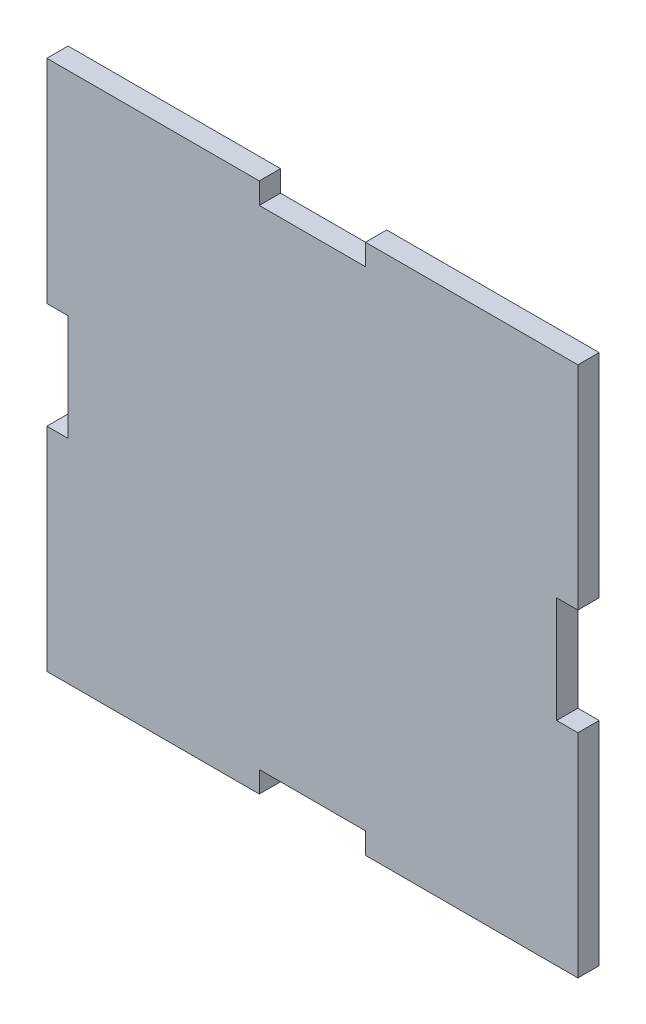
ISO-10303-21;
HEADER;
FILE_DESCRIPTION(('STEP AP214'),'2;1');
FILE_NAME('part.step','',(''),(''),'','','');
FILE_SCHEMA(('AUTOMOTIVE_DESIGN { 1 0 10303 214 1 1 1 1 }'));
ENDSEC;
DATA;
#1=APPLICATION_CONTEXT('core data for automotive mechanical design processes');
#2=APPLICATION_PROTOCOL_DEFINITION('international standard','automotive_design',2000,#1);
#3=PRODUCT_CONTEXT('',#1,'mechanical');
#4=PRODUCT('Part','Part','',(#3));
#5=PRODUCT_RELATED_PRODUCT_CATEGORY('part','',(#4));
#6=PRODUCT_DEFINITION_FORMATION('','',#4);
#7=PRODUCT_DEFINITION_CONTEXT('part definition',#1,'design');
#8=PRODUCT_DEFINITION('design','',#6,#7);
#9=PRODUCT_DEFINITION_SHAPE('','',#8);
#10=(LENGTH_UNIT() NAMED_UNIT(*) SI_UNIT(.MILLI.,.METRE.));
#11=(NAMED_UNIT(*) PLANE_ANGLE_UNIT() SI_UNIT($,.RADIAN.));
#12=(NAMED_UNIT(*) SI_UNIT($,.STERADIAN.) SOLID_ANGLE_UNIT());
#13=UNCERTAINTY_MEASURE_WITH_UNIT(LENGTH_MEASURE(1.E-05),#10,'distance_accuracy_value','');
#14=(GEOMETRIC_REPRESENTATION_CONTEXT(3) GLOBAL_UNCERTAINTY_ASSIGNED_CONTEXT((#13)) GLOBAL_UNIT_ASSIGNED_CONTEXT((#10,
#11,#12)) REPRESENTATION_CONTEXT('',''));
#15=CARTESIAN_POINT('',(0.,0.,0.));
#16=DIRECTION('',(0.,0.,1.));
#17=DIRECTION('',(1.,0.,0.));
#18=AXIS2_PLACEMENT_3D('',#15,#16,#17);
#19=CARTESIAN_POINT('',(96.,0.,4.));
#20=DIRECTION('',(1.,0.,0.));
#21=DIRECTION('',(0.,1.,0.));
#22=AXIS2_PLACEMENT_3D('',#19,#20,#21);
#23=PLANE('',#22);
#24=DIRECTION('',(0.,-1.,0.));
#25=VECTOR('',#24,1.);
#26=CARTESIAN_POINT('',(96.,0.,0.));
#27=LINE('',#26,#25);
#28=CARTESIAN_POINT('',(96.,60.,0.));
#29=VERTEX_POINT('',#28);
#30=CARTESIAN_POINT('',(96.,40.,0.));
#31=VERTEX_POINT('',#30);
#32=EDGE_CURVE('E308',#29,#31,#27,.T.);
#33=ORIENTED_EDGE('',*,*,#32,.F.);
#34=DIRECTION('',(0.,0.,-1.));
#35=VECTOR('',#34,1.);
#36=CARTESIAN_POINT('',(96.,60.,4.));
#37=LINE('',#36,#35);
#38=CARTESIAN_POINT('',(96.,60.,4.));
#39=VERTEX_POINT('',#38);
#40=EDGE_CURVE('E11',#39,#29,#37,.T.);
#41=ORIENTED_EDGE('',*,*,#40,.F.);
#42=DIRECTION('',(0.,-1.,0.));
#43=VECTOR('',#42,1.);
#44=CARTESIAN_POINT('',(96.,0.,4.));
#45=LINE('',#44,#43);
#46=CARTESIAN_POINT('',(96.,40.,4.));
#47=VERTEX_POINT('',#46);
#48=EDGE_CURVE('E224',#39,#47,#45,.T.);
#49=ORIENTED_EDGE('',*,*,#48,.T.);
#50=DIRECTION('',(0.,0.,-1.));
#51=VECTOR('',#50,1.);
#52=CARTESIAN_POINT('',(96.,40.,4.));
#53=LINE('',#52,#51);
#54=EDGE_CURVE('E129',#47,#31,#53,.T.);
#55=ORIENTED_EDGE('',*,*,#54,.T.);
#56=EDGE_LOOP('',(#33,#41,#49,#55));
#57=FACE_BOUND('',#56,.T.);
#58=ADVANCED_FACE('F41',(#57),#23,.T.);
#59=CARTESIAN_POINT('',(0.,60.,4.));
#60=DIRECTION('',(0.,-1.,0.));
#61=DIRECTION('',(0.,0.,-1.));
#62=AXIS2_PLACEMENT_3D('',#59,#60,#61);
#63=PLANE('',#62);
#64=DIRECTION('',(-1.,0.,0.));
#65=VECTOR('',#64,1.);
#66=CARTESIAN_POINT('',(0.,60.,0.));
#67=LINE('',#66,#65);
#68=CARTESIAN_POINT('',(100.,60.,0.));
#69=VERTEX_POINT('',#68);
#70=EDGE_CURVE('E301',#69,#29,#67,.T.);
#71=ORIENTED_EDGE('',*,*,#70,.F.);
#72=DIRECTION('',(0.,0.,-1.));
#73=VECTOR('',#72,1.);
#74=CARTESIAN_POINT('',(100.,60.,4.));
#75=LINE('',#74,#73);
#76=CARTESIAN_POINT('',(100.,60.,4.));
#77=VERTEX_POINT('',#76);
#78=EDGE_CURVE('E50',#77,#69,#75,.T.);
#79=ORIENTED_EDGE('',*,*,#78,.F.);
#80=DIRECTION('',(-1.,0.,0.));
#81=VECTOR('',#80,1.);
#82=CARTESIAN_POINT('',(0.,60.,4.));
#83=LINE('',#82,#81);
#84=EDGE_CURVE('E213',#77,#39,#83,.T.);
#85=ORIENTED_EDGE('',*,*,#84,.T.);
#86=ORIENTED_EDGE('',*,*,#40,.T.);
#87=EDGE_LOOP('',(#71,#79,#85,#86));
#88=FACE_BOUND('',#87,.T.);
#89=ADVANCED_FACE('F306',(#88),#63,.T.);
#90=CARTESIAN_POINT('',(100.,0.,4.));
#91=DIRECTION('',(-1.,0.,0.));
#92=DIRECTION('',(0.,0.,1.));
#93=AXIS2_PLACEMENT_3D('',#90,#91,#92);
#94=PLANE('',#93);
#95=DIRECTION('',(0.,1.,0.));
#96=VECTOR('',#95,1.);
#97=CARTESIAN_POINT('',(100.,0.,0.));
#98=LINE('',#97,#96);
#99=CARTESIAN_POINT('',(100.,100.,0.));
#100=VERTEX_POINT('',#99);
#101=EDGE_CURVE('E236',#69,#100,#98,.T.);
#102=ORIENTED_EDGE('',*,*,#101,.T.);
#103=DIRECTION('',(0.,0.,-1.));
#104=VECTOR('',#103,1.);
#105=CARTESIAN_POINT('',(100.,100.,4.));
#106=LINE('',#105,#104);
#107=CARTESIAN_POINT('',(100.,100.,4.));
#108=VERTEX_POINT('',#107);
#109=EDGE_CURVE('E289',#108,#100,#106,.T.);
#110=ORIENTED_EDGE('',*,*,#109,.F.);
#111=DIRECTION('',(0.,1.,0.));
#112=VECTOR('',#111,1.);
#113=CARTESIAN_POINT('',(100.,0.,4.));
#114=LINE('',#113,#112);
#115=EDGE_CURVE('E206',#77,#108,#114,.T.);
#116=ORIENTED_EDGE('',*,*,#115,.F.);
#117=ORIENTED_EDGE('',*,*,#78,.T.);
#118=EDGE_LOOP('',(#102,#110,#116,#117));
#119=FACE_BOUND('',#118,.T.);
#120=ADVANCED_FACE('F295',(#119),#94,.F.);
#121=CARTESIAN_POINT('',(0.,100.,4.));
#122=DIRECTION('',(0.,1.,0.));
#123=DIRECTION('',(0.,0.,1.));
#124=AXIS2_PLACEMENT_3D('',#121,#122,#123);
#125=PLANE('',#124);
#126=DIRECTION('',(1.,0.,0.));
#127=VECTOR('',#126,1.);
#128=CARTESIAN_POINT('',(0.,100.,0.));
#129=LINE('',#128,#127);
#130=CARTESIAN_POINT('',(60.,100.,0.));
#131=VERTEX_POINT('',#130);
#132=EDGE_CURVE('E304',#131,#100,#129,.T.);
#133=ORIENTED_EDGE('',*,*,#132,.F.);
#134=DIRECTION('',(0.,0.,-1.));
#135=VECTOR('',#134,1.);
#136=CARTESIAN_POINT('',(60.,100.,4.));
#137=LINE('',#136,#135);
#138=CARTESIAN_POINT('',(60.,100.,4.));
#139=VERTEX_POINT('',#138);
#140=EDGE_CURVE('E286',#139,#131,#137,.T.);
#141=ORIENTED_EDGE('',*,*,#140,.F.);
#142=DIRECTION('',(1.,0.,0.));
#143=VECTOR('',#142,1.);
#144=CARTESIAN_POINT('',(0.,100.,4.));
#145=LINE('',#144,#143);
#146=EDGE_CURVE('E212',#139,#108,#145,.T.);
#147=ORIENTED_EDGE('',*,*,#146,.T.);
#148=ORIENTED_EDGE('',*,*,#109,.T.);
#149=EDGE_LOOP('',(#133,#141,#147,#148));
#150=FACE_BOUND('',#149,.T.);
#151=ADVANCED_FACE('F463',(#150),#125,.T.);
#152=CARTESIAN_POINT('',(60.,0.,4.));
#153=DIRECTION('',(1.,0.,0.));
#154=DIRECTION('',(0.,0.,-1.));
#155=AXIS2_PLACEMENT_3D('',#152,#153,#154);
#156=PLANE('',#155);
#157=DIRECTION('',(0.,-1.,0.));
#158=VECTOR('',#157,1.);
#159=CARTESIAN_POINT('',(60.,0.,0.));
#160=LINE('',#159,#158);
#161=CARTESIAN_POINT('',(60.,96.,0.));
#162=VERTEX_POINT('',#161);
#163=EDGE_CURVE('E315',#131,#162,#160,.T.);
#164=ORIENTED_EDGE('',*,*,#163,.T.);
#165=DIRECTION('',(0.,0.,-1.));
#166=VECTOR('',#165,1.);
#167=CARTESIAN_POINT('',(60.,96.,4.));
#168=LINE('',#167,#166);
#169=CARTESIAN_POINT('',(60.,96.,4.));
#170=VERTEX_POINT('',#169);
#171=EDGE_CURVE('E283',#170,#162,#168,.T.);
#172=ORIENTED_EDGE('',*,*,#171,.F.);
#173=DIRECTION('',(0.,-1.,0.));
#174=VECTOR('',#173,1.);
#175=CARTESIAN_POINT('',(60.,0.,4.));
#176=LINE('',#175,#174);
#177=EDGE_CURVE('E221',#139,#170,#176,.T.);
#178=ORIENTED_EDGE('',*,*,#177,.F.);
#179=ORIENTED_EDGE('',*,*,#140,.T.);
#180=EDGE_LOOP('',(#164,#172,#178,#179));
#181=FACE_BOUND('',#180,.T.);
#182=ADVANCED_FACE('F404',(#181),#156,.F.);
#183=CARTESIAN_POINT('',(0.,96.,4.));
#184=DIRECTION('',(0.,1.,0.));
#185=DIRECTION('',(0.,0.,1.));
#186=AXIS2_PLACEMENT_3D('',#183,#184,#185);
#187=PLANE('',#186);
#188=DIRECTION('',(1.,0.,0.));
#189=VECTOR('',#188,1.);
#190=CARTESIAN_POINT('',(0.,96.,0.));
#191=LINE('',#190,#189);
#192=CARTESIAN_POINT('',(40.,96.,0.));
#193=VERTEX_POINT('',#192);
#194=EDGE_CURVE('E320',#193,#162,#191,.T.);
#195=ORIENTED_EDGE('',*,*,#194,.F.);
#196=DIRECTION('',(0.,0.,-1.));
#197=VECTOR('',#196,1.);
#198=CARTESIAN_POINT('',(40.,96.,4.));
#199=LINE('',#198,#197);
#200=CARTESIAN_POINT('',(40.,96.,4.));
#201=VERTEX_POINT('',#200);
#202=EDGE_CURVE('E280',#201,#193,#199,.T.);
#203=ORIENTED_EDGE('',*,*,#202,.F.);
#204=DIRECTION('',(1.,0.,0.));
#205=VECTOR('',#204,1.);
#206=CARTESIAN_POINT('',(0.,96.,4.));
#207=LINE('',#206,#205);
#208=EDGE_CURVE('E394',#201,#170,#207,.T.);
#209=ORIENTED_EDGE('',*,*,#208,.T.);
#210=ORIENTED_EDGE('',*,*,#171,.T.);
#211=EDGE_LOOP('',(#195,#203,#209,#210));
#212=FACE_BOUND('',#211,.T.);
#213=ADVANCED_FACE('F407',(#212),#187,.T.);
#214=CARTESIAN_POINT('',(40.,0.,4.));
#215=DIRECTION('',(1.,0.,0.));
#216=DIRECTION('',(0.,0.,-1.));
#217=AXIS2_PLACEMENT_3D('',#214,#215,#216);
#218=PLANE('',#217);
#219=DIRECTION('',(0.,-1.,0.));
#220=VECTOR('',#219,1.);
#221=CARTESIAN_POINT('',(40.,0.,0.));
#222=LINE('',#221,#220);
#223=CARTESIAN_POINT('',(40.,100.,0.));
#224=VERTEX_POINT('',#223);
#225=EDGE_CURVE('E324',#224,#193,#222,.T.);
#226=ORIENTED_EDGE('',*,*,#225,.F.);
#227=DIRECTION('',(0.,0.,-1.));
#228=VECTOR('',#227,1.);
#229=CARTESIAN_POINT('',(40.,100.,4.));
#230=LINE('',#229,#228);
#231=CARTESIAN_POINT('',(40.,100.,4.));
#232=VERTEX_POINT('',#231);
#233=EDGE_CURVE('E277',#232,#224,#230,.T.);
#234=ORIENTED_EDGE('',*,*,#233,.F.);
#235=DIRECTION('',(0.,-1.,0.));
#236=VECTOR('',#235,1.);
#237=CARTESIAN_POINT('',(40.,0.,4.));
#238=LINE('',#237,#236);
#239=EDGE_CURVE('E390',#232,#201,#238,.T.);
#240=ORIENTED_EDGE('',*,*,#239,.T.);
#241=ORIENTED_EDGE('',*,*,#202,.T.);
#242=EDGE_LOOP('',(#226,#234,#240,#241));
#243=FACE_BOUND('',#242,.T.);
#244=ADVANCED_FACE('F410',(#243),#218,.T.);
#245=CARTESIAN_POINT('',(0.,100.,0.));
#246=VERTEX_POINT('',#245);
#247=EDGE_CURVE('E316',#246,#224,#129,.T.);
#248=ORIENTED_EDGE('',*,*,#247,.F.);
#249=DIRECTION('',(0.,0.,-1.));
#250=VECTOR('',#249,1.);
#251=CARTESIAN_POINT('',(0.,100.,4.));
#252=LINE('',#251,#250);
#253=CARTESIAN_POINT('',(0.,100.,4.));
#254=VERTEX_POINT('',#253);
#255=EDGE_CURVE('E274',#254,#246,#252,.T.);
#256=ORIENTED_EDGE('',*,*,#255,.F.);
#257=EDGE_CURVE('E222',#254,#232,#145,.T.);
#258=ORIENTED_EDGE('',*,*,#257,.T.);
#259=ORIENTED_EDGE('',*,*,#233,.T.);
#260=EDGE_LOOP('',(#248,#256,#258,#259));
#261=FACE_BOUND('',#260,.T.);
#262=ADVANCED_FACE('F417',(#261),#125,.T.);
#263=CARTESIAN_POINT('',(0.,0.,4.));
#264=DIRECTION('',(-1.,0.,0.));
#265=DIRECTION('',(0.,0.,1.));
#266=AXIS2_PLACEMENT_3D('',#263,#264,#265);
#267=PLANE('',#266);
#268=DIRECTION('',(0.,1.,0.));
#269=VECTOR('',#268,1.);
#270=CARTESIAN_POINT('',(0.,0.,0.));
#271=LINE('',#270,#269);
#272=CARTESIAN_POINT('',(0.,60.,0.));
#273=VERTEX_POINT('',#272);
#274=EDGE_CURVE('E328',#273,#246,#271,.T.);
#275=ORIENTED_EDGE('',*,*,#274,.F.);
#276=DIRECTION('',(0.,0.,-1.));
#277=VECTOR('',#276,1.);
#278=CARTESIAN_POINT('',(0.,60.,4.));
#279=LINE('',#278,#277);
#280=CARTESIAN_POINT('',(0.,60.,4.));
#281=VERTEX_POINT('',#280);
#282=EDGE_CURVE('E271',#281,#273,#279,.T.);
#283=ORIENTED_EDGE('',*,*,#282,.F.);
#284=DIRECTION('',(0.,1.,0.));
#285=VECTOR('',#284,1.);
#286=CARTESIAN_POINT('',(0.,0.,4.));
#287=LINE('',#286,#285);
#288=EDGE_CURVE('E386',#281,#254,#287,.T.);
#289=ORIENTED_EDGE('',*,*,#288,.T.);
#290=ORIENTED_EDGE('',*,*,#255,.T.);
#291=EDGE_LOOP('',(#275,#283,#289,#290));
#292=FACE_BOUND('',#291,.T.);
#293=ADVANCED_FACE('F441',(#292),#267,.T.);
#294=CARTESIAN_POINT('',(0.,60.,4.));
#295=DIRECTION('',(0.,1.,0.));
#296=DIRECTION('',(0.,0.,1.));
#297=AXIS2_PLACEMENT_3D('',#294,#295,#296);
#298=PLANE('',#297);
#299=DIRECTION('',(1.,0.,0.));
#300=VECTOR('',#299,1.);
#301=CARTESIAN_POINT('',(0.,60.,0.));
#302=LINE('',#301,#300);
#303=CARTESIAN_POINT('',(4.,60.,0.));
#304=VERTEX_POINT('',#303);
#305=EDGE_CURVE('E332',#273,#304,#302,.T.);
#306=ORIENTED_EDGE('',*,*,#305,.T.);
#307=DIRECTION('',(0.,0.,-1.));
#308=VECTOR('',#307,1.);
#309=CARTESIAN_POINT('',(4.,60.,4.));
#310=LINE('',#309,#308);
#311=CARTESIAN_POINT('',(4.,60.,4.));
#312=VERTEX_POINT('',#311);
#313=EDGE_CURVE('E267',#312,#304,#310,.T.);
#314=ORIENTED_EDGE('',*,*,#313,.F.);
#315=DIRECTION('',(1.,0.,0.));
#316=VECTOR('',#315,1.);
#317=CARTESIAN_POINT('',(0.,60.,4.));
#318=LINE('',#317,#316);
#319=EDGE_CURVE('E383',#281,#312,#318,.T.);
#320=ORIENTED_EDGE('',*,*,#319,.F.);
#321=ORIENTED_EDGE('',*,*,#282,.T.);
#322=EDGE_LOOP('',(#306,#314,#320,#321));
#323=FACE_BOUND('',#322,.T.);
#324=ADVANCED_FACE('F445',(#323),#298,.F.);
#325=CARTESIAN_POINT('',(4.,0.,4.));
#326=DIRECTION('',(1.,0.,0.));
#327=DIRECTION('',(0.,1.,0.));
#328=AXIS2_PLACEMENT_3D('',#325,#326,#327);
#329=PLANE('',#328);
#330=DIRECTION('',(0.,-1.,0.));
#331=VECTOR('',#330,1.);
#332=CARTESIAN_POINT('',(4.,0.,0.));
#333=LINE('',#332,#331);
#334=CARTESIAN_POINT('',(4.,40.,0.));
#335=VERTEX_POINT('',#334);
#336=EDGE_CURVE('E336',#304,#335,#333,.T.);
#337=ORIENTED_EDGE('',*,*,#336,.T.);
#338=DIRECTION('',(0.,0.,-1.));
#339=VECTOR('',#338,1.);
#340=CARTESIAN_POINT('',(4.,40.,4.));
#341=LINE('',#340,#339);
#342=CARTESIAN_POINT('',(4.,40.,4.));
#343=VERTEX_POINT('',#342);
#344=EDGE_CURVE('E264',#343,#335,#341,.T.);
#345=ORIENTED_EDGE('',*,*,#344,.F.);
#346=DIRECTION('',(0.,-1.,0.));
#347=VECTOR('',#346,1.);
#348=CARTESIAN_POINT('',(4.,0.,4.));
#349=LINE('',#348,#347);
#350=EDGE_CURVE('E380',#312,#343,#349,.T.);
#351=ORIENTED_EDGE('',*,*,#350,.F.);
#352=ORIENTED_EDGE('',*,*,#313,.T.);
#353=EDGE_LOOP('',(#337,#345,#351,#352));
#354=FACE_BOUND('',#353,.T.);
#355=ADVANCED_FACE('F447',(#354),#329,.F.);
#356=CARTESIAN_POINT('',(0.,40.,4.));
#357=DIRECTION('',(0.,1.,0.));
#358=DIRECTION('',(0.,0.,1.));
#359=AXIS2_PLACEMENT_3D('',#356,#357,#358);
#360=PLANE('',#359);
#361=DIRECTION('',(1.,0.,0.));
#362=VECTOR('',#361,1.);
#363=CARTESIAN_POINT('',(0.,40.,0.));
#364=LINE('',#363,#362);
#365=CARTESIAN_POINT('',(0.,40.,0.));
#366=VERTEX_POINT('',#365);
#367=EDGE_CURVE('E340',#366,#335,#364,.T.);
#368=ORIENTED_EDGE('',*,*,#367,.F.);
#369=DIRECTION('',(0.,0.,-1.));
#370=VECTOR('',#369,1.);
#371=CARTESIAN_POINT('',(0.,40.,4.));
#372=LINE('',#371,#370);
#373=CARTESIAN_POINT('',(0.,40.,4.));
#374=VERTEX_POINT('',#373);
#375=EDGE_CURVE('E261',#374,#366,#372,.T.);
#376=ORIENTED_EDGE('',*,*,#375,.F.);
#377=DIRECTION('',(1.,0.,0.));
#378=VECTOR('',#377,1.);
#379=CARTESIAN_POINT('',(0.,40.,4.));
#380=LINE('',#379,#378);
#381=EDGE_CURVE('E376',#374,#343,#380,.T.);
#382=ORIENTED_EDGE('',*,*,#381,.T.);
#383=ORIENTED_EDGE('',*,*,#344,.T.);
#384=EDGE_LOOP('',(#368,#376,#382,#383));
#385=FACE_BOUND('',#384,.T.);
#386=ADVANCED_FACE('F432',(#385),#360,.T.);
#387=CARTESIAN_POINT('',(0.,0.,0.));
#388=VERTEX_POINT('',#387);
#389=EDGE_CURVE('E333',#388,#366,#271,.T.);
#390=ORIENTED_EDGE('',*,*,#389,.F.);
#391=DIRECTION('',(0.,0.,-1.));
#392=VECTOR('',#391,1.);
#393=CARTESIAN_POINT('',(0.,0.,4.));
#394=LINE('',#393,#392);
#395=CARTESIAN_POINT('',(0.,0.,4.));
#396=VERTEX_POINT('',#395);
#397=EDGE_CURVE('E258',#396,#388,#394,.T.);
#398=ORIENTED_EDGE('',*,*,#397,.F.);
#399=EDGE_CURVE('E375',#396,#374,#287,.T.);
#400=ORIENTED_EDGE('',*,*,#399,.T.);
#401=ORIENTED_EDGE('',*,*,#375,.T.);
#402=EDGE_LOOP('',(#390,#398,#400,#401));
#403=FACE_BOUND('',#402,.T.);
#404=ADVANCED_FACE('F424',(#403),#267,.T.);
#405=CARTESIAN_POINT('',(0.,0.,4.));
#406=DIRECTION('',(0.,1.,0.));
#407=DIRECTION('',(0.,0.,1.));
#408=AXIS2_PLACEMENT_3D('',#405,#406,#407);
#409=PLANE('',#408);
#410=DIRECTION('',(1.,0.,0.));
#411=VECTOR('',#410,1.);
#412=CARTESIAN_POINT('',(0.,0.,0.));
#413=LINE('',#412,#411);
#414=CARTESIAN_POINT('',(40.,0.,0.));
#415=VERTEX_POINT('',#414);
#416=EDGE_CURVE('E344',#388,#415,#413,.T.);
#417=ORIENTED_EDGE('',*,*,#416,.T.);
#418=DIRECTION('',(0.,0.,-1.));
#419=VECTOR('',#418,1.);
#420=CARTESIAN_POINT('',(40.,0.,4.));
#421=LINE('',#420,#419);
#422=CARTESIAN_POINT('',(40.,0.,4.));
#423=VERTEX_POINT('',#422);
#424=EDGE_CURVE('E254',#423,#415,#421,.T.);
#425=ORIENTED_EDGE('',*,*,#424,.F.);
#426=DIRECTION('',(1.,0.,0.));
#427=VECTOR('',#426,1.);
#428=CARTESIAN_POINT('',(0.,0.,4.));
#429=LINE('',#428,#427);
#430=EDGE_CURVE('E194',#396,#423,#429,.T.);
#431=ORIENTED_EDGE('',*,*,#430,.F.);
#432=ORIENTED_EDGE('',*,*,#397,.T.);
#433=EDGE_LOOP('',(#417,#425,#431,#432));
#434=FACE_BOUND('',#433,.T.);
#435=ADVANCED_FACE('F530',(#434),#409,.F.);
#436=CARTESIAN_POINT('',(40.,0.,4.));
#437=DIRECTION('',(-1.,0.,0.));
#438=DIRECTION('',(0.,0.,1.));
#439=AXIS2_PLACEMENT_3D('',#436,#437,#438);
#440=PLANE('',#439);
#441=DIRECTION('',(0.,1.,0.));
#442=VECTOR('',#441,1.);
#443=CARTESIAN_POINT('',(40.,0.,0.));
#444=LINE('',#443,#442);
#445=CARTESIAN_POINT('',(40.,4.,0.));
#446=VERTEX_POINT('',#445);
#447=EDGE_CURVE('E347',#415,#446,#444,.T.);
#448=ORIENTED_EDGE('',*,*,#447,.T.);
#449=DIRECTION('',(0.,0.,-1.));
#450=VECTOR('',#449,1.);
#451=CARTESIAN_POINT('',(40.,4.,4.));
#452=LINE('',#451,#450);
#453=CARTESIAN_POINT('',(40.,4.,4.));
#454=VERTEX_POINT('',#453);
#455=EDGE_CURVE('E250',#454,#446,#452,.T.);
#456=ORIENTED_EDGE('',*,*,#455,.F.);
#457=DIRECTION('',(0.,1.,0.));
#458=VECTOR('',#457,1.);
#459=CARTESIAN_POINT('',(40.,0.,4.));
#460=LINE('',#459,#458);
#461=EDGE_CURVE('E367',#423,#454,#460,.T.);
#462=ORIENTED_EDGE('',*,*,#461,.F.);
#463=ORIENTED_EDGE('',*,*,#424,.T.);
#464=EDGE_LOOP('',(#448,#456,#462,#463));
#465=FACE_BOUND('',#464,.T.);
#466=ADVANCED_FACE('F538',(#465),#440,.F.);
#467=CARTESIAN_POINT('',(0.,4.,4.));
#468=DIRECTION('',(0.,1.,0.));
#469=DIRECTION('',(0.,0.,1.));
#470=AXIS2_PLACEMENT_3D('',#467,#468,#469);
#471=PLANE('',#470);
#472=DIRECTION('',(1.,0.,0.));
#473=VECTOR('',#472,1.);
#474=CARTESIAN_POINT('',(0.,4.,0.));
#475=LINE('',#474,#473);
#476=CARTESIAN_POINT('',(60.,4.,0.));
#477=VERTEX_POINT('',#476);
#478=EDGE_CURVE('E349',#446,#477,#475,.T.);
#479=ORIENTED_EDGE('',*,*,#478,.T.);
#480=DIRECTION('',(0.,0.,-1.));
#481=VECTOR('',#480,1.);
#482=CARTESIAN_POINT('',(60.,4.,4.));
#483=LINE('',#482,#481);
#484=CARTESIAN_POINT('',(60.,4.,4.));
#485=VERTEX_POINT('',#484);
#486=EDGE_CURVE('E247',#485,#477,#483,.T.);
#487=ORIENTED_EDGE('',*,*,#486,.F.);
#488=DIRECTION('',(1.,0.,0.));
#489=VECTOR('',#488,1.);
#490=CARTESIAN_POINT('',(0.,4.,4.));
#491=LINE('',#490,#489);
#492=EDGE_CURVE('E364',#454,#485,#491,.T.);
#493=ORIENTED_EDGE('',*,*,#492,.F.);
#494=ORIENTED_EDGE('',*,*,#455,.T.);
#495=EDGE_LOOP('',(#479,#487,#493,#494));
#496=FACE_BOUND('',#495,.T.);
#497=ADVANCED_FACE('F363',(#496),#471,.F.);
#498=CARTESIAN_POINT('',(60.,0.,4.));
#499=DIRECTION('',(-1.,0.,0.));
#500=DIRECTION('',(0.,0.,1.));
#501=AXIS2_PLACEMENT_3D('',#498,#499,#500);
#502=PLANE('',#501);
#503=DIRECTION('',(0.,1.,0.));
#504=VECTOR('',#503,1.);
#505=CARTESIAN_POINT('',(60.,0.,0.));
#506=LINE('',#505,#504);
#507=CARTESIAN_POINT('',(60.,0.,0.));
#508=VERTEX_POINT('',#507);
#509=EDGE_CURVE('E239',#508,#477,#506,.T.);
#510=ORIENTED_EDGE('',*,*,#509,.F.);
#511=DIRECTION('',(0.,0.,-1.));
#512=VECTOR('',#511,1.);
#513=CARTESIAN_POINT('',(60.,0.,4.));
#514=LINE('',#513,#512);
#515=CARTESIAN_POINT('',(60.,0.,4.));
#516=VERTEX_POINT('',#515);
#517=EDGE_CURVE('E200',#516,#508,#514,.T.);
#518=ORIENTED_EDGE('',*,*,#517,.F.);
#519=DIRECTION('',(0.,1.,0.));
#520=VECTOR('',#519,1.);
#521=CARTESIAN_POINT('',(60.,0.,4.));
#522=LINE('',#521,#520);
#523=EDGE_CURVE('E190',#516,#485,#522,.T.);
#524=ORIENTED_EDGE('',*,*,#523,.T.);
#525=ORIENTED_EDGE('',*,*,#486,.T.);
#526=EDGE_LOOP('',(#510,#518,#524,#525));
#527=FACE_BOUND('',#526,.T.);
#528=ADVANCED_FACE('F361',(#527),#502,.T.);
#529=CARTESIAN_POINT('',(100.,0.,0.));
#530=VERTEX_POINT('',#529);
#531=EDGE_CURVE('E198',#508,#530,#413,.T.);
#532=ORIENTED_EDGE('',*,*,#531,.T.);
#533=DIRECTION('',(0.,0.,-1.));
#534=VECTOR('',#533,1.);
#535=CARTESIAN_POINT('',(100.,0.,4.));
#536=LINE('',#535,#534);
#537=CARTESIAN_POINT('',(100.,0.,4.));
#538=VERTEX_POINT('',#537);
#539=EDGE_CURVE('E195',#538,#530,#536,.T.);
#540=ORIENTED_EDGE('',*,*,#539,.F.);
#541=EDGE_CURVE('E184',#516,#538,#429,.T.);
#542=ORIENTED_EDGE('',*,*,#541,.F.);
#543=ORIENTED_EDGE('',*,*,#517,.T.);
#544=EDGE_LOOP('',(#532,#540,#542,#543));
#545=FACE_BOUND('',#544,.T.);
#546=ADVANCED_FACE('F196',(#545),#409,.F.);
#547=CARTESIAN_POINT('',(100.,40.,0.));
#548=VERTEX_POINT('',#547);
#549=EDGE_CURVE('E122',#530,#548,#98,.T.);
#550=ORIENTED_EDGE('',*,*,#549,.T.);
#551=DIRECTION('',(0.,0.,-1.));
#552=VECTOR('',#551,1.);
#553=CARTESIAN_POINT('',(100.,40.,4.));
#554=LINE('',#553,#552);
#555=CARTESIAN_POINT('',(100.,40.,4.));
#556=VERTEX_POINT('',#555);
#557=EDGE_CURVE('E201',#556,#548,#554,.T.);
#558=ORIENTED_EDGE('',*,*,#557,.F.);
#559=EDGE_CURVE('E188',#538,#556,#114,.T.);
#560=ORIENTED_EDGE('',*,*,#559,.F.);
#561=ORIENTED_EDGE('',*,*,#539,.T.);
#562=EDGE_LOOP('',(#550,#558,#560,#561));
#563=FACE_BOUND('',#562,.T.);
#564=ADVANCED_FACE('F203',(#563),#94,.F.);
#565=CARTESIAN_POINT('',(0.,40.,4.));
#566=DIRECTION('',(0.,-1.,0.));
#567=DIRECTION('',(0.,0.,-1.));
#568=AXIS2_PLACEMENT_3D('',#565,#566,#567);
#569=PLANE('',#568);
#570=DIRECTION('',(-1.,0.,0.));
#571=VECTOR('',#570,1.);
#572=CARTESIAN_POINT('',(0.,40.,0.));
#573=LINE('',#572,#571);
#574=EDGE_CURVE('E227',#548,#31,#573,.T.);
#575=ORIENTED_EDGE('',*,*,#574,.T.);
#576=ORIENTED_EDGE('',*,*,#54,.F.);
#577=DIRECTION('',(-1.,0.,0.));
#578=VECTOR('',#577,1.);
#579=CARTESIAN_POINT('',(0.,40.,4.));
#580=LINE('',#579,#578);
#581=EDGE_CURVE('E58',#556,#47,#580,.T.);
#582=ORIENTED_EDGE('',*,*,#581,.F.);
#583=ORIENTED_EDGE('',*,*,#557,.T.);
#584=EDGE_LOOP('',(#575,#576,#582,#583));
#585=FACE_BOUND('',#584,.T.);
#586=ADVANCED_FACE('F580',(#585),#569,.F.);
#587=CARTESIAN_POINT('',(0.,0.,4.));
#588=DIRECTION('',(0.,0.,1.));
#589=DIRECTION('',(1.,0.,0.));
#590=AXIS2_PLACEMENT_3D('',#587,#588,#589);
#591=PLANE('',#590);
#592=ORIENTED_EDGE('',*,*,#48,.F.);
#593=ORIENTED_EDGE('',*,*,#84,.F.);
#594=ORIENTED_EDGE('',*,*,#115,.T.);
#595=ORIENTED_EDGE('',*,*,#146,.F.);
#596=ORIENTED_EDGE('',*,*,#177,.T.);
#597=ORIENTED_EDGE('',*,*,#208,.F.);
#598=ORIENTED_EDGE('',*,*,#239,.F.);
#599=ORIENTED_EDGE('',*,*,#257,.F.);
#600=ORIENTED_EDGE('',*,*,#288,.F.);
#601=ORIENTED_EDGE('',*,*,#319,.T.);
#602=ORIENTED_EDGE('',*,*,#350,.T.);
#603=ORIENTED_EDGE('',*,*,#381,.F.);
#604=ORIENTED_EDGE('',*,*,#399,.F.);
#605=ORIENTED_EDGE('',*,*,#430,.T.);
#606=ORIENTED_EDGE('',*,*,#461,.T.);
#607=ORIENTED_EDGE('',*,*,#492,.T.);
#608=ORIENTED_EDGE('',*,*,#523,.F.);
#609=ORIENTED_EDGE('',*,*,#541,.T.);
#610=ORIENTED_EDGE('',*,*,#559,.T.);
#611=ORIENTED_EDGE('',*,*,#581,.T.);
#612=EDGE_LOOP('',(#592,#593,#594,#595,#596,#597,#598,#599,#600,#601,#602,#603,#604,#605,#606,
#607,#608,#609,#610,#611));
#613=FACE_BOUND('',#612,.T.);
#614=ADVANCED_FACE('F186',(#613),#591,.T.);
#615=CARTESIAN_POINT('',(0.,0.,0.));
#616=DIRECTION('',(0.,0.,1.));
#617=DIRECTION('',(1.,0.,0.));
#618=AXIS2_PLACEMENT_3D('',#615,#616,#617);
#619=PLANE('',#618);
#620=ORIENTED_EDGE('',*,*,#32,.T.);
#621=ORIENTED_EDGE('',*,*,#574,.F.);
#622=ORIENTED_EDGE('',*,*,#549,.F.);
#623=ORIENTED_EDGE('',*,*,#531,.F.);
#624=ORIENTED_EDGE('',*,*,#509,.T.);
#625=ORIENTED_EDGE('',*,*,#478,.F.);
#626=ORIENTED_EDGE('',*,*,#447,.F.);
#627=ORIENTED_EDGE('',*,*,#416,.F.);
#628=ORIENTED_EDGE('',*,*,#389,.T.);
#629=ORIENTED_EDGE('',*,*,#367,.T.);
#630=ORIENTED_EDGE('',*,*,#336,.F.);
#631=ORIENTED_EDGE('',*,*,#305,.F.);
#632=ORIENTED_EDGE('',*,*,#274,.T.);
#633=ORIENTED_EDGE('',*,*,#247,.T.);
#634=ORIENTED_EDGE('',*,*,#225,.T.);
#635=ORIENTED_EDGE('',*,*,#194,.T.);
#636=ORIENTED_EDGE('',*,*,#163,.F.);
#637=ORIENTED_EDGE('',*,*,#132,.T.);
#638=ORIENTED_EDGE('',*,*,#101,.F.);
#639=ORIENTED_EDGE('',*,*,#70,.T.);
#640=EDGE_LOOP('',(#620,#621,#622,#623,#624,#625,#626,#627,#628,#629,#630,#631,#632,#633,#634,
#635,#636,#637,#638,#639));
#641=FACE_BOUND('',#640,.T.);
#642=ADVANCED_FACE('F300',(#641),#619,.F.);
#643=CLOSED_SHELL('',(#58,#89,#120,#151,#182,#213,#244,#262,#293,#324,#355,#386,#404,#435,#466,
#497,#528,#546,#564,#586,#614,#642));
#644=MANIFOLD_SOLID_BREP('B2',#643);
#645=ADVANCED_BREP_SHAPE_REPRESENTATION('',(#18,#644),#14);
#646=SHAPE_DEFINITION_REPRESENTATION(#9,#645);
ENDSEC;
END-ISO-10303-21;
